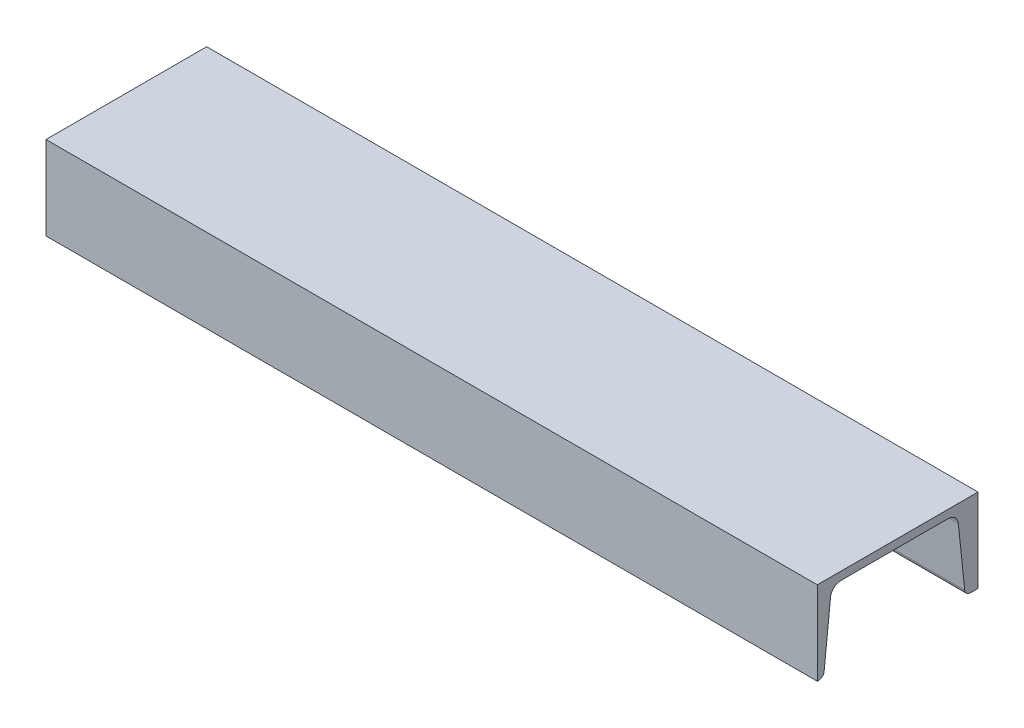
ISO-10303-21;
HEADER;
FILE_DESCRIPTION(('STEP AP214'),'2;1');
FILE_NAME('part.step','',(''),(''),'','','');
FILE_SCHEMA(('AUTOMOTIVE_DESIGN { 1 0 10303 214 1 1 1 1 }'));
ENDSEC;
DATA;
#1=APPLICATION_CONTEXT('core data for automotive mechanical design processes');
#2=APPLICATION_PROTOCOL_DEFINITION('international standard','automotive_design',2000,#1);
#3=PRODUCT_CONTEXT('',#1,'mechanical');
#4=PRODUCT('Part','Part','',(#3));
#5=PRODUCT_RELATED_PRODUCT_CATEGORY('part','',(#4));
#6=PRODUCT_DEFINITION_FORMATION('','',#4);
#7=PRODUCT_DEFINITION_CONTEXT('part definition',#1,'design');
#8=PRODUCT_DEFINITION('design','',#6,#7);
#9=PRODUCT_DEFINITION_SHAPE('','',#8);
#10=(LENGTH_UNIT() NAMED_UNIT(*) SI_UNIT(.MILLI.,.METRE.));
#11=(NAMED_UNIT(*) PLANE_ANGLE_UNIT() SI_UNIT($,.RADIAN.));
#12=(NAMED_UNIT(*) SI_UNIT($,.STERADIAN.) SOLID_ANGLE_UNIT());
#13=UNCERTAINTY_MEASURE_WITH_UNIT(LENGTH_MEASURE(1.E-05),#10,'distance_accuracy_value','');
#14=(GEOMETRIC_REPRESENTATION_CONTEXT(3) GLOBAL_UNCERTAINTY_ASSIGNED_CONTEXT((#13)) GLOBAL_UNIT_ASSIGNED_CONTEXT((#10,
#11,#12)) REPRESENTATION_CONTEXT('',''));
#15=CARTESIAN_POINT('',(0.,0.,0.));
#16=DIRECTION('',(0.,0.,1.));
#17=DIRECTION('',(1.,0.,0.));
#18=AXIS2_PLACEMENT_3D('',#15,#16,#17);
#19=CARTESIAN_POINT('',(-600.,-60.5,124.164669163818));
#20=DIRECTION('',(1.,0.,0.));
#21=DIRECTION('',(0.,0.,-1.));
#22=AXIS2_PLACEMENT_3D('',#19,#20,#21);
#23=CYLINDRICAL_SURFACE('',#22,4.5);
#24=CARTESIAN_POINT('',(0.,-60.5,124.164669163818));
#25=DIRECTION('',(-1.,0.,0.));
#26=DIRECTION('',(0.,0.,1.));
#27=AXIS2_PLACEMENT_3D('',#24,#25,#26);
#28=CIRCLE('',#27,4.5);
#29=CARTESIAN_POINT('',(0.,-60.9703780847044,119.689320634661));
#30=VERTEX_POINT('',#29);
#31=CARTESIAN_POINT('',(0.,-65.,124.164669163818));
#32=VERTEX_POINT('',#31);
#33=EDGE_CURVE('E200',#30,#32,#28,.T.);
#34=ORIENTED_EDGE('',*,*,#33,.T.);
#35=DIRECTION('',(1.,0.,0.));
#36=VECTOR('',#35,1.);
#37=CARTESIAN_POINT('',(-600.,-65.,124.164669163818));
#38=LINE('',#37,#36);
#39=CARTESIAN_POINT('',(-600.,-65.,124.164669163818));
#40=VERTEX_POINT('',#39);
#41=EDGE_CURVE('E13',#40,#32,#38,.T.);
#42=ORIENTED_EDGE('',*,*,#41,.F.);
#43=CARTESIAN_POINT('',(-600.,-60.5,124.164669163818));
#44=DIRECTION('',(-1.,0.,0.));
#45=DIRECTION('',(0.,0.,1.));
#46=AXIS2_PLACEMENT_3D('',#43,#44,#45);
#47=CIRCLE('',#46,4.5);
#48=CARTESIAN_POINT('',(-600.,-60.9703780847044,119.689320634661));
#49=VERTEX_POINT('',#48);
#50=EDGE_CURVE('E222',#49,#40,#47,.T.);
#51=ORIENTED_EDGE('',*,*,#50,.F.);
#52=DIRECTION('',(1.,0.,0.));
#53=VECTOR('',#52,1.);
#54=CARTESIAN_POINT('',(-600.,-60.9703780847044,119.689320634661));
#55=LINE('',#54,#53);
#56=EDGE_CURVE('E196',#49,#30,#55,.T.);
#57=ORIENTED_EDGE('',*,*,#56,.T.);
#58=EDGE_LOOP('',(#34,#42,#51,#57));
#59=FACE_BOUND('',#58,.T.);
#60=ADVANCED_FACE('F80',(#59),#23,.T.);
#61=CARTESIAN_POINT('',(-600.,-65.,125.));
#62=DIRECTION('',(0.,1.,0.));
#63=DIRECTION('',(0.,0.,1.));
#64=AXIS2_PLACEMENT_3D('',#61,#62,#63);
#65=PLANE('',#64);
#66=DIRECTION('',(0.,0.,1.));
#67=VECTOR('',#66,1.);
#68=CARTESIAN_POINT('',(0.,-65.,125.));
#69=LINE('',#68,#67);
#70=CARTESIAN_POINT('',(0.,-65.,125.));
#71=VERTEX_POINT('',#70);
#72=EDGE_CURVE('E203',#32,#71,#69,.T.);
#73=ORIENTED_EDGE('',*,*,#72,.T.);
#74=DIRECTION('',(1.,0.,0.));
#75=VECTOR('',#74,1.);
#76=CARTESIAN_POINT('',(-600.,-65.,125.));
#77=LINE('',#76,#75);
#78=CARTESIAN_POINT('',(-600.,-65.,125.));
#79=VERTEX_POINT('',#78);
#80=EDGE_CURVE('E88',#79,#71,#77,.T.);
#81=ORIENTED_EDGE('',*,*,#80,.F.);
#82=DIRECTION('',(0.,0.,1.));
#83=VECTOR('',#82,1.);
#84=CARTESIAN_POINT('',(-600.,-65.,125.));
#85=LINE('',#84,#83);
#86=EDGE_CURVE('E151',#40,#79,#85,.T.);
#87=ORIENTED_EDGE('',*,*,#86,.F.);
#88=ORIENTED_EDGE('',*,*,#41,.T.);
#89=EDGE_LOOP('',(#73,#81,#87,#88));
#90=FACE_BOUND('',#89,.T.);
#91=ADVANCED_FACE('F300',(#90),#65,.F.);
#92=CARTESIAN_POINT('',(-600.,-65.,125.));
#93=DIRECTION('',(0.,0.,-1.));
#94=DIRECTION('',(0.,1.,0.));
#95=AXIS2_PLACEMENT_3D('',#92,#93,#94);
#96=PLANE('',#95);
#97=DIRECTION('',(0.,1.,0.));
#98=VECTOR('',#97,1.);
#99=CARTESIAN_POINT('',(0.,-65.,125.));
#100=LINE('',#99,#98);
#101=CARTESIAN_POINT('',(0.,0.,125.));
#102=VERTEX_POINT('',#101);
#103=EDGE_CURVE('E205',#71,#102,#100,.T.);
#104=ORIENTED_EDGE('',*,*,#103,.T.);
#105=DIRECTION('',(1.,0.,0.));
#106=VECTOR('',#105,1.);
#107=CARTESIAN_POINT('',(-600.,0.,125.));
#108=LINE('',#107,#106);
#109=CARTESIAN_POINT('',(-600.,0.,125.));
#110=VERTEX_POINT('',#109);
#111=EDGE_CURVE('E241',#110,#102,#108,.T.);
#112=ORIENTED_EDGE('',*,*,#111,.F.);
#113=DIRECTION('',(0.,1.,0.));
#114=VECTOR('',#113,1.);
#115=CARTESIAN_POINT('',(-600.,-65.,125.));
#116=LINE('',#115,#114);
#117=EDGE_CURVE('E249',#79,#110,#116,.T.);
#118=ORIENTED_EDGE('',*,*,#117,.F.);
#119=ORIENTED_EDGE('',*,*,#80,.T.);
#120=EDGE_LOOP('',(#104,#112,#118,#119));
#121=FACE_BOUND('',#120,.T.);
#122=ADVANCED_FACE('F247',(#121),#96,.F.);
#123=CARTESIAN_POINT('',(-600.,0.,125.));
#124=DIRECTION('',(0.,-1.,0.));
#125=DIRECTION('',(0.,0.,-1.));
#126=AXIS2_PLACEMENT_3D('',#123,#124,#125);
#127=PLANE('',#126);
#128=DIRECTION('',(0.,0.,-1.));
#129=VECTOR('',#128,1.);
#130=CARTESIAN_POINT('',(0.,0.,125.));
#131=LINE('',#130,#129);
#132=CARTESIAN_POINT('',(0.,0.,0.));
#133=VERTEX_POINT('',#132);
#134=EDGE_CURVE('E207',#102,#133,#131,.T.);
#135=ORIENTED_EDGE('',*,*,#134,.T.);
#136=DIRECTION('',(1.,0.,0.));
#137=VECTOR('',#136,1.);
#138=CARTESIAN_POINT('',(-600.,0.,0.));
#139=LINE('',#138,#137);
#140=CARTESIAN_POINT('',(-600.,0.,0.));
#141=VERTEX_POINT('',#140);
#142=EDGE_CURVE('E238',#141,#133,#139,.T.);
#143=ORIENTED_EDGE('',*,*,#142,.F.);
#144=DIRECTION('',(0.,0.,-1.));
#145=VECTOR('',#144,1.);
#146=CARTESIAN_POINT('',(-600.,0.,125.));
#147=LINE('',#146,#145);
#148=EDGE_CURVE('E267',#110,#141,#147,.T.);
#149=ORIENTED_EDGE('',*,*,#148,.F.);
#150=ORIENTED_EDGE('',*,*,#111,.T.);
#151=EDGE_LOOP('',(#135,#143,#149,#150));
#152=FACE_BOUND('',#151,.T.);
#153=ADVANCED_FACE('F258',(#152),#127,.F.);
#154=CARTESIAN_POINT('',(-600.,-65.,0.));
#155=DIRECTION('',(0.,0.,1.));
#156=DIRECTION('',(0.,-1.,0.));
#157=AXIS2_PLACEMENT_3D('',#154,#155,#156);
#158=PLANE('',#157);
#159=DIRECTION('',(0.,-1.,0.));
#160=VECTOR('',#159,1.);
#161=CARTESIAN_POINT('',(0.,-65.,0.));
#162=LINE('',#161,#160);
#163=CARTESIAN_POINT('',(0.,-65.,0.));
#164=VERTEX_POINT('',#163);
#165=EDGE_CURVE('E209',#133,#164,#162,.T.);
#166=ORIENTED_EDGE('',*,*,#165,.T.);
#167=DIRECTION('',(1.,0.,0.));
#168=VECTOR('',#167,1.);
#169=CARTESIAN_POINT('',(-600.,-65.,0.));
#170=LINE('',#169,#168);
#171=CARTESIAN_POINT('',(-600.,-65.,0.));
#172=VERTEX_POINT('',#171);
#173=EDGE_CURVE('E235',#172,#164,#170,.T.);
#174=ORIENTED_EDGE('',*,*,#173,.F.);
#175=DIRECTION('',(0.,-1.,0.));
#176=VECTOR('',#175,1.);
#177=CARTESIAN_POINT('',(-600.,-65.,0.));
#178=LINE('',#177,#176);
#179=EDGE_CURVE('E264',#141,#172,#178,.T.);
#180=ORIENTED_EDGE('',*,*,#179,.F.);
#181=ORIENTED_EDGE('',*,*,#142,.T.);
#182=EDGE_LOOP('',(#166,#174,#180,#181));
#183=FACE_BOUND('',#182,.T.);
#184=ADVANCED_FACE('F262',(#183),#158,.F.);
#185=CARTESIAN_POINT('',(-600.,-65.,0.));
#186=DIRECTION('',(0.,1.,0.));
#187=DIRECTION('',(0.,0.,1.));
#188=AXIS2_PLACEMENT_3D('',#185,#186,#187);
#189=PLANE('',#188);
#190=DIRECTION('',(0.,0.,1.));
#191=VECTOR('',#190,1.);
#192=CARTESIAN_POINT('',(0.,-65.,0.));
#193=LINE('',#192,#191);
#194=CARTESIAN_POINT('',(0.,-65.,5.84533083618209));
#195=VERTEX_POINT('',#194);
#196=EDGE_CURVE('E211',#164,#195,#193,.T.);
#197=ORIENTED_EDGE('',*,*,#196,.T.);
#198=DIRECTION('',(1.,0.,0.));
#199=VECTOR('',#198,1.);
#200=CARTESIAN_POINT('',(-600.,-65.,5.84533083618209));
#201=LINE('',#200,#199);
#202=CARTESIAN_POINT('',(-600.,-65.,5.84533083618209));
#203=VERTEX_POINT('',#202);
#204=EDGE_CURVE('E232',#203,#195,#201,.T.);
#205=ORIENTED_EDGE('',*,*,#204,.F.);
#206=DIRECTION('',(0.,0.,1.));
#207=VECTOR('',#206,1.);
#208=CARTESIAN_POINT('',(-600.,-65.,0.));
#209=LINE('',#208,#207);
#210=EDGE_CURVE('E266',#172,#203,#209,.T.);
#211=ORIENTED_EDGE('',*,*,#210,.F.);
#212=ORIENTED_EDGE('',*,*,#173,.T.);
#213=EDGE_LOOP('',(#197,#205,#211,#212));
#214=FACE_BOUND('',#213,.T.);
#215=ADVANCED_FACE('F313',(#214),#189,.F.);
#216=CARTESIAN_POINT('',(-600.,-60.5,5.84533083618209));
#217=DIRECTION('',(1.,0.,0.));
#218=DIRECTION('',(0.,0.,-1.));
#219=AXIS2_PLACEMENT_3D('',#216,#217,#218);
#220=CYLINDRICAL_SURFACE('',#219,4.5);
#221=CARTESIAN_POINT('',(0.,-60.5,5.84533083618209));
#222=DIRECTION('',(-1.,0.,0.));
#223=DIRECTION('',(0.,0.,-1.));
#224=AXIS2_PLACEMENT_3D('',#221,#222,#223);
#225=CIRCLE('',#224,4.5);
#226=CARTESIAN_POINT('',(0.,-60.9703780847044,10.3206793653393));
#227=VERTEX_POINT('',#226);
#228=EDGE_CURVE('E213',#195,#227,#225,.T.);
#229=ORIENTED_EDGE('',*,*,#228,.T.);
#230=DIRECTION('',(1.,0.,0.));
#231=VECTOR('',#230,1.);
#232=CARTESIAN_POINT('',(-600.,-60.9703780847044,10.3206793653393));
#233=LINE('',#232,#231);
#234=CARTESIAN_POINT('',(-600.,-60.9703780847044,10.3206793653393));
#235=VERTEX_POINT('',#234);
#236=EDGE_CURVE('E229',#235,#227,#233,.T.);
#237=ORIENTED_EDGE('',*,*,#236,.F.);
#238=CARTESIAN_POINT('',(-600.,-60.5,5.84533083618209));
#239=DIRECTION('',(-1.,0.,0.));
#240=DIRECTION('',(0.,0.,-1.));
#241=AXIS2_PLACEMENT_3D('',#238,#239,#240);
#242=CIRCLE('',#241,4.5);
#243=EDGE_CURVE('E269',#203,#235,#242,.T.);
#244=ORIENTED_EDGE('',*,*,#243,.F.);
#245=ORIENTED_EDGE('',*,*,#204,.T.);
#246=EDGE_LOOP('',(#229,#237,#244,#245));
#247=FACE_BOUND('',#246,.T.);
#248=ADVANCED_FACE('F316',(#247),#220,.T.);
#249=CARTESIAN_POINT('',(-600.,-13.4637722938588,15.3138248370538));
#250=DIRECTION('',(0.,0.104528463267647,-0.994521895368274));
#251=DIRECTION('',(0.,0.994521895368274,0.104528463267647));
#252=AXIS2_PLACEMENT_3D('',#249,#250,#251);
#253=PLANE('',#252);
#254=DIRECTION('',(0.,0.994521895368274,0.104528463267647));
#255=VECTOR('',#254,1.);
#256=CARTESIAN_POINT('',(0.,-13.4637722938588,15.3138248370538));
#257=LINE('',#256,#255);
#258=CARTESIAN_POINT('',(0.,-13.4637722938588,15.3138248370538));
#259=VERTEX_POINT('',#258);
#260=EDGE_CURVE('E215',#227,#259,#257,.T.);
#261=ORIENTED_EDGE('',*,*,#260,.T.);
#262=DIRECTION('',(1.,0.,0.));
#263=VECTOR('',#262,1.);
#264=CARTESIAN_POINT('',(-600.,-13.4637722938588,15.3138248370538));
#265=LINE('',#264,#263);
#266=CARTESIAN_POINT('',(-600.,-13.4637722938588,15.3138248370538));
#267=VERTEX_POINT('',#266);
#268=EDGE_CURVE('E226',#267,#259,#265,.T.);
#269=ORIENTED_EDGE('',*,*,#268,.F.);
#270=DIRECTION('',(0.,0.994521895368274,0.104528463267647));
#271=VECTOR('',#270,1.);
#272=CARTESIAN_POINT('',(-600.,-13.4637722938588,15.3138248370538));
#273=LINE('',#272,#271);
#274=EDGE_CURVE('E275',#235,#267,#273,.T.);
#275=ORIENTED_EDGE('',*,*,#274,.F.);
#276=ORIENTED_EDGE('',*,*,#236,.T.);
#277=EDGE_LOOP('',(#261,#269,#275,#276));
#278=FACE_BOUND('',#277,.T.);
#279=ADVANCED_FACE('F281',(#278),#253,.F.);
#280=CARTESIAN_POINT('',(-600.,-14.3,23.27));
#281=DIRECTION('',(1.,0.,0.));
#282=DIRECTION('',(0.,0.,-1.));
#283=AXIS2_PLACEMENT_3D('',#280,#281,#282);
#284=CYLINDRICAL_SURFACE('',#283,8.);
#285=CARTESIAN_POINT('',(0.,-14.3,23.27));
#286=DIRECTION('',(1.,0.,0.));
#287=DIRECTION('',(0.,0.,1.));
#288=AXIS2_PLACEMENT_3D('',#285,#286,#287);
#289=CIRCLE('',#288,8.);
#290=CARTESIAN_POINT('',(0.,-6.30000000000001,23.27));
#291=VERTEX_POINT('',#290);
#292=EDGE_CURVE('E217',#259,#291,#289,.T.);
#293=ORIENTED_EDGE('',*,*,#292,.T.);
#294=DIRECTION('',(1.,0.,0.));
#295=VECTOR('',#294,1.);
#296=CARTESIAN_POINT('',(-600.,-6.30000000000001,23.27));
#297=LINE('',#296,#295);
#298=CARTESIAN_POINT('',(-600.,-6.30000000000001,23.27));
#299=VERTEX_POINT('',#298);
#300=EDGE_CURVE('E191',#299,#291,#297,.T.);
#301=ORIENTED_EDGE('',*,*,#300,.F.);
#302=CARTESIAN_POINT('',(-600.,-14.3,23.27));
#303=DIRECTION('',(1.,0.,0.));
#304=DIRECTION('',(0.,0.,1.));
#305=AXIS2_PLACEMENT_3D('',#302,#303,#304);
#306=CIRCLE('',#305,8.);
#307=EDGE_CURVE('E182',#267,#299,#306,.T.);
#308=ORIENTED_EDGE('',*,*,#307,.F.);
#309=ORIENTED_EDGE('',*,*,#268,.T.);
#310=EDGE_LOOP('',(#293,#301,#308,#309));
#311=FACE_BOUND('',#310,.T.);
#312=ADVANCED_FACE('F285',(#311),#284,.F.);
#313=CARTESIAN_POINT('',(-600.,-6.3,106.74));
#314=DIRECTION('',(0.,1.,0.));
#315=DIRECTION('',(0.,0.,1.));
#316=AXIS2_PLACEMENT_3D('',#313,#314,#315);
#317=PLANE('',#316);
#318=DIRECTION('',(0.,0.,1.));
#319=VECTOR('',#318,1.);
#320=CARTESIAN_POINT('',(0.,-6.3,106.74));
#321=LINE('',#320,#319);
#322=CARTESIAN_POINT('',(0.,-6.3,106.74));
#323=VERTEX_POINT('',#322);
#324=EDGE_CURVE('E190',#291,#323,#321,.T.);
#325=ORIENTED_EDGE('',*,*,#324,.T.);
#326=DIRECTION('',(1.,0.,0.));
#327=VECTOR('',#326,1.);
#328=CARTESIAN_POINT('',(-600.,-6.3,106.74));
#329=LINE('',#328,#327);
#330=CARTESIAN_POINT('',(-600.,-6.3,106.74));
#331=VERTEX_POINT('',#330);
#332=EDGE_CURVE('E187',#331,#323,#329,.T.);
#333=ORIENTED_EDGE('',*,*,#332,.F.);
#334=DIRECTION('',(0.,0.,1.));
#335=VECTOR('',#334,1.);
#336=CARTESIAN_POINT('',(-600.,-6.3,106.74));
#337=LINE('',#336,#335);
#338=EDGE_CURVE('E176',#299,#331,#337,.T.);
#339=ORIENTED_EDGE('',*,*,#338,.F.);
#340=ORIENTED_EDGE('',*,*,#300,.T.);
#341=EDGE_LOOP('',(#325,#333,#339,#340));
#342=FACE_BOUND('',#341,.T.);
#343=ADVANCED_FACE('F188',(#342),#317,.F.);
#344=CARTESIAN_POINT('',(-600.,-14.3,106.74));
#345=DIRECTION('',(1.,0.,0.));
#346=DIRECTION('',(0.,0.,-1.));
#347=AXIS2_PLACEMENT_3D('',#344,#345,#346);
#348=CYLINDRICAL_SURFACE('',#347,8.);
#349=CARTESIAN_POINT('',(0.,-14.3,106.74));
#350=DIRECTION('',(1.,0.,0.));
#351=DIRECTION('',(0.,0.,-1.));
#352=AXIS2_PLACEMENT_3D('',#349,#350,#351);
#353=CIRCLE('',#352,8.);
#354=CARTESIAN_POINT('',(0.,-13.4637722938588,114.696175162946));
#355=VERTEX_POINT('',#354);
#356=EDGE_CURVE('E137',#323,#355,#353,.T.);
#357=ORIENTED_EDGE('',*,*,#356,.T.);
#358=DIRECTION('',(1.,0.,0.));
#359=VECTOR('',#358,1.);
#360=CARTESIAN_POINT('',(-600.,-13.4637722938588,114.696175162946));
#361=LINE('',#360,#359);
#362=CARTESIAN_POINT('',(-600.,-13.4637722938588,114.696175162946));
#363=VERTEX_POINT('',#362);
#364=EDGE_CURVE('E192',#363,#355,#361,.T.);
#365=ORIENTED_EDGE('',*,*,#364,.F.);
#366=CARTESIAN_POINT('',(-600.,-14.3,106.74));
#367=DIRECTION('',(1.,0.,0.));
#368=DIRECTION('',(0.,0.,-1.));
#369=AXIS2_PLACEMENT_3D('',#366,#367,#368);
#370=CIRCLE('',#369,8.);
#371=EDGE_CURVE('E180',#331,#363,#370,.T.);
#372=ORIENTED_EDGE('',*,*,#371,.F.);
#373=ORIENTED_EDGE('',*,*,#332,.T.);
#374=EDGE_LOOP('',(#357,#365,#372,#373));
#375=FACE_BOUND('',#374,.T.);
#376=ADVANCED_FACE('F194',(#375),#348,.F.);
#377=CARTESIAN_POINT('',(-600.,-13.4637722938588,114.696175162946));
#378=DIRECTION('',(0.,0.104528463267646,0.994521895368274));
#379=DIRECTION('',(0.,-0.994521895368274,0.104528463267646));
#380=AXIS2_PLACEMENT_3D('',#377,#378,#379);
#381=PLANE('',#380);
#382=DIRECTION('',(0.,-0.994521895368274,0.104528463267646));
#383=VECTOR('',#382,1.);
#384=CARTESIAN_POINT('',(0.,-13.4637722938588,114.696175162946));
#385=LINE('',#384,#383);
#386=EDGE_CURVE('E143',#355,#30,#385,.T.);
#387=ORIENTED_EDGE('',*,*,#386,.T.);
#388=ORIENTED_EDGE('',*,*,#56,.F.);
#389=DIRECTION('',(0.,-0.994521895368274,0.104528463267646));
#390=VECTOR('',#389,1.);
#391=CARTESIAN_POINT('',(-600.,-13.4637722938588,114.696175162946));
#392=LINE('',#391,#390);
#393=EDGE_CURVE('E96',#363,#49,#392,.T.);
#394=ORIENTED_EDGE('',*,*,#393,.F.);
#395=ORIENTED_EDGE('',*,*,#364,.T.);
#396=EDGE_LOOP('',(#387,#388,#394,#395));
#397=FACE_BOUND('',#396,.T.);
#398=ADVANCED_FACE('F289',(#397),#381,.F.);
#399=CARTESIAN_POINT('',(-600.,-60.5,124.164669163818));
#400=DIRECTION('',(-1.,0.,0.));
#401=DIRECTION('',(0.,0.,1.));
#402=AXIS2_PLACEMENT_3D('',#399,#400,#401);
#403=PLANE('',#402);
#404=ORIENTED_EDGE('',*,*,#50,.T.);
#405=ORIENTED_EDGE('',*,*,#86,.T.);
#406=ORIENTED_EDGE('',*,*,#117,.T.);
#407=ORIENTED_EDGE('',*,*,#148,.T.);
#408=ORIENTED_EDGE('',*,*,#179,.T.);
#409=ORIENTED_EDGE('',*,*,#210,.T.);
#410=ORIENTED_EDGE('',*,*,#243,.T.);
#411=ORIENTED_EDGE('',*,*,#274,.T.);
#412=ORIENTED_EDGE('',*,*,#307,.T.);
#413=ORIENTED_EDGE('',*,*,#338,.T.);
#414=ORIENTED_EDGE('',*,*,#371,.T.);
#415=ORIENTED_EDGE('',*,*,#393,.T.);
#416=EDGE_LOOP('',(#404,#405,#406,#407,#408,#409,#410,#411,#412,#413,#414,#415));
#417=FACE_BOUND('',#416,.T.);
#418=ADVANCED_FACE('F178',(#417),#403,.T.);
#419=CARTESIAN_POINT('',(0.,-60.5,124.164669163818));
#420=DIRECTION('',(-1.,0.,0.));
#421=DIRECTION('',(0.,0.,1.));
#422=AXIS2_PLACEMENT_3D('',#419,#420,#421);
#423=PLANE('',#422);
#424=ORIENTED_EDGE('',*,*,#33,.F.);
#425=ORIENTED_EDGE('',*,*,#386,.F.);
#426=ORIENTED_EDGE('',*,*,#356,.F.);
#427=ORIENTED_EDGE('',*,*,#324,.F.);
#428=ORIENTED_EDGE('',*,*,#292,.F.);
#429=ORIENTED_EDGE('',*,*,#260,.F.);
#430=ORIENTED_EDGE('',*,*,#228,.F.);
#431=ORIENTED_EDGE('',*,*,#196,.F.);
#432=ORIENTED_EDGE('',*,*,#165,.F.);
#433=ORIENTED_EDGE('',*,*,#134,.F.);
#434=ORIENTED_EDGE('',*,*,#103,.F.);
#435=ORIENTED_EDGE('',*,*,#72,.F.);
#436=EDGE_LOOP('',(#424,#425,#426,#427,#428,#429,#430,#431,#432,#433,#434,#435));
#437=FACE_BOUND('',#436,.T.);
#438=ADVANCED_FACE('F253',(#437),#423,.F.);
#439=CLOSED_SHELL('',(#60,#91,#122,#153,#184,#215,#248,#279,#312,#343,#376,#398,#418,#438));
#440=MANIFOLD_SOLID_BREP('B2',#439);
#441=ADVANCED_BREP_SHAPE_REPRESENTATION('',(#18,#440),#14);
#442=SHAPE_DEFINITION_REPRESENTATION(#9,#441);
ENDSEC;
END-ISO-10303-21;
